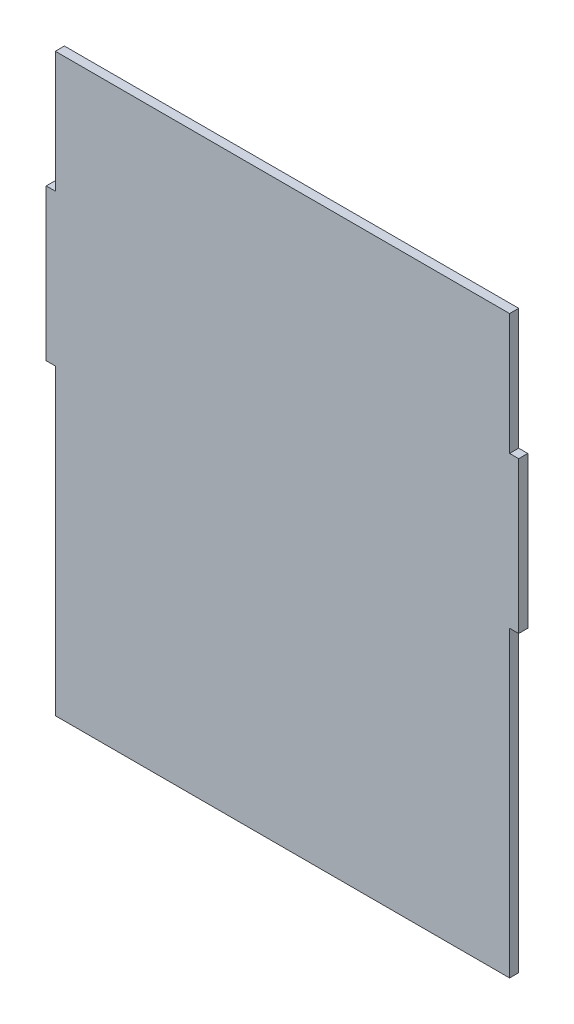
ISO-10303-21;
HEADER;
FILE_DESCRIPTION(('STEP AP214'),'2;1');
FILE_NAME('part.step','',(''),(''),'','','');
FILE_SCHEMA(('AUTOMOTIVE_DESIGN { 1 0 10303 214 1 1 1 1 }'));
ENDSEC;
DATA;
#1=APPLICATION_CONTEXT('core data for automotive mechanical design processes');
#2=APPLICATION_PROTOCOL_DEFINITION('international standard','automotive_design',2000,#1);
#3=PRODUCT_CONTEXT('',#1,'mechanical');
#4=PRODUCT('Part','Part','',(#3));
#5=PRODUCT_RELATED_PRODUCT_CATEGORY('part','',(#4));
#6=PRODUCT_DEFINITION_FORMATION('','',#4);
#7=PRODUCT_DEFINITION_CONTEXT('part definition',#1,'design');
#8=PRODUCT_DEFINITION('design','',#6,#7);
#9=PRODUCT_DEFINITION_SHAPE('','',#8);
#10=(LENGTH_UNIT() NAMED_UNIT(*) SI_UNIT(.MILLI.,.METRE.));
#11=(NAMED_UNIT(*) PLANE_ANGLE_UNIT() SI_UNIT($,.RADIAN.));
#12=(NAMED_UNIT(*) SI_UNIT($,.STERADIAN.) SOLID_ANGLE_UNIT());
#13=UNCERTAINTY_MEASURE_WITH_UNIT(LENGTH_MEASURE(1.E-05),#10,'distance_accuracy_value','');
#14=(GEOMETRIC_REPRESENTATION_CONTEXT(3) GLOBAL_UNCERTAINTY_ASSIGNED_CONTEXT((#13)) GLOBAL_UNIT_ASSIGNED_CONTEXT((#10,
#11,#12)) REPRESENTATION_CONTEXT('',''));
#15=CARTESIAN_POINT('',(0.,0.,0.));
#16=DIRECTION('',(0.,0.,1.));
#17=DIRECTION('',(1.,0.,0.));
#18=AXIS2_PLACEMENT_3D('',#15,#16,#17);
#19=CARTESIAN_POINT('',(0.,0.,3.));
#20=DIRECTION('',(1.,0.,0.));
#21=DIRECTION('',(0.,1.,0.));
#22=AXIS2_PLACEMENT_3D('',#19,#20,#21);
#23=PLANE('',#22);
#24=DIRECTION('',(0.,-1.,0.));
#25=VECTOR('',#24,1.);
#26=CARTESIAN_POINT('',(0.,0.,0.));
#27=LINE('',#26,#25);
#28=CARTESIAN_POINT('',(0.,100.,0.));
#29=VERTEX_POINT('',#28);
#30=CARTESIAN_POINT('',(0.,0.,0.));
#31=VERTEX_POINT('',#30);
#32=EDGE_CURVE('E164',#29,#31,#27,.T.);
#33=ORIENTED_EDGE('',*,*,#32,.T.);
#34=DIRECTION('',(0.,0.,-1.));
#35=VECTOR('',#34,1.);
#36=CARTESIAN_POINT('',(0.,0.,3.));
#37=LINE('',#36,#35);
#38=CARTESIAN_POINT('',(0.,0.,3.));
#39=VERTEX_POINT('',#38);
#40=EDGE_CURVE('E11',#39,#31,#37,.T.);
#41=ORIENTED_EDGE('',*,*,#40,.F.);
#42=DIRECTION('',(0.,-1.,0.));
#43=VECTOR('',#42,1.);
#44=CARTESIAN_POINT('',(0.,0.,3.));
#45=LINE('',#44,#43);
#46=CARTESIAN_POINT('',(0.,100.,3.));
#47=VERTEX_POINT('',#46);
#48=EDGE_CURVE('E198',#47,#39,#45,.T.);
#49=ORIENTED_EDGE('',*,*,#48,.F.);
#50=DIRECTION('',(0.,0.,-1.));
#51=VECTOR('',#50,1.);
#52=CARTESIAN_POINT('',(0.,100.,3.));
#53=LINE('',#52,#51);
#54=EDGE_CURVE('E160',#47,#29,#53,.T.);
#55=ORIENTED_EDGE('',*,*,#54,.T.);
#56=EDGE_LOOP('',(#33,#41,#49,#55));
#57=FACE_BOUND('',#56,.T.);
#58=ADVANCED_FACE('F39',(#57),#23,.F.);
#59=CARTESIAN_POINT('',(0.,0.,3.));
#60=DIRECTION('',(0.,1.,0.));
#61=DIRECTION('',(0.,0.,1.));
#62=AXIS2_PLACEMENT_3D('',#59,#60,#61);
#63=PLANE('',#62);
#64=DIRECTION('',(1.,0.,0.));
#65=VECTOR('',#64,1.);
#66=CARTESIAN_POINT('',(0.,0.,0.));
#67=LINE('',#66,#65);
#68=CARTESIAN_POINT('',(150.,0.,0.));
#69=VERTEX_POINT('',#68);
#70=EDGE_CURVE('E168',#31,#69,#67,.T.);
#71=ORIENTED_EDGE('',*,*,#70,.T.);
#72=DIRECTION('',(0.,0.,-1.));
#73=VECTOR('',#72,1.);
#74=CARTESIAN_POINT('',(150.,0.,3.));
#75=LINE('',#74,#73);
#76=CARTESIAN_POINT('',(150.,0.,3.));
#77=VERTEX_POINT('',#76);
#78=EDGE_CURVE('E48',#77,#69,#75,.T.);
#79=ORIENTED_EDGE('',*,*,#78,.F.);
#80=DIRECTION('',(1.,0.,0.));
#81=VECTOR('',#80,1.);
#82=CARTESIAN_POINT('',(0.,0.,3.));
#83=LINE('',#82,#81);
#84=EDGE_CURVE('E111',#39,#77,#83,.T.);
#85=ORIENTED_EDGE('',*,*,#84,.F.);
#86=ORIENTED_EDGE('',*,*,#40,.T.);
#87=EDGE_LOOP('',(#71,#79,#85,#86));
#88=FACE_BOUND('',#87,.T.);
#89=ADVANCED_FACE('F292',(#88),#63,.F.);
#90=CARTESIAN_POINT('',(150.,0.,3.));
#91=DIRECTION('',(-1.,0.,0.));
#92=DIRECTION('',(0.,0.,1.));
#93=AXIS2_PLACEMENT_3D('',#90,#91,#92);
#94=PLANE('',#93);
#95=DIRECTION('',(0.,1.,0.));
#96=VECTOR('',#95,1.);
#97=CARTESIAN_POINT('',(150.,0.,0.));
#98=LINE('',#97,#96);
#99=CARTESIAN_POINT('',(150.,100.,0.));
#100=VERTEX_POINT('',#99);
#101=EDGE_CURVE('E171',#69,#100,#98,.T.);
#102=ORIENTED_EDGE('',*,*,#101,.T.);
#103=DIRECTION('',(0.,0.,-1.));
#104=VECTOR('',#103,1.);
#105=CARTESIAN_POINT('',(150.,100.,3.));
#106=LINE('',#105,#104);
#107=CARTESIAN_POINT('',(150.,100.,3.));
#108=VERTEX_POINT('',#107);
#109=EDGE_CURVE('E225',#108,#100,#106,.T.);
#110=ORIENTED_EDGE('',*,*,#109,.F.);
#111=DIRECTION('',(0.,1.,0.));
#112=VECTOR('',#111,1.);
#113=CARTESIAN_POINT('',(150.,0.,3.));
#114=LINE('',#113,#112);
#115=EDGE_CURVE('E235',#77,#108,#114,.T.);
#116=ORIENTED_EDGE('',*,*,#115,.F.);
#117=ORIENTED_EDGE('',*,*,#78,.T.);
#118=EDGE_LOOP('',(#102,#110,#116,#117));
#119=FACE_BOUND('',#118,.T.);
#120=ADVANCED_FACE('F233',(#119),#94,.F.);
#121=CARTESIAN_POINT('',(150.,100.,3.));
#122=DIRECTION('',(0.,1.,0.));
#123=DIRECTION('',(0.,0.,1.));
#124=AXIS2_PLACEMENT_3D('',#121,#122,#123);
#125=PLANE('',#124);
#126=DIRECTION('',(1.,0.,0.));
#127=VECTOR('',#126,1.);
#128=CARTESIAN_POINT('',(150.,100.,0.));
#129=LINE('',#128,#127);
#130=CARTESIAN_POINT('',(153.,100.,0.));
#131=VERTEX_POINT('',#130);
#132=EDGE_CURVE('E174',#100,#131,#129,.T.);
#133=ORIENTED_EDGE('',*,*,#132,.T.);
#134=DIRECTION('',(0.,0.,-1.));
#135=VECTOR('',#134,1.);
#136=CARTESIAN_POINT('',(153.,100.,3.));
#137=LINE('',#136,#135);
#138=CARTESIAN_POINT('',(153.,100.,3.));
#139=VERTEX_POINT('',#138);
#140=EDGE_CURVE('E221',#139,#131,#137,.T.);
#141=ORIENTED_EDGE('',*,*,#140,.F.);
#142=DIRECTION('',(1.,0.,0.));
#143=VECTOR('',#142,1.);
#144=CARTESIAN_POINT('',(150.,100.,3.));
#145=LINE('',#144,#143);
#146=EDGE_CURVE('E254',#108,#139,#145,.T.);
#147=ORIENTED_EDGE('',*,*,#146,.F.);
#148=ORIENTED_EDGE('',*,*,#109,.T.);
#149=EDGE_LOOP('',(#133,#141,#147,#148));
#150=FACE_BOUND('',#149,.T.);
#151=ADVANCED_FACE('F244',(#150),#125,.F.);
#152=CARTESIAN_POINT('',(153.,150.,3.));
#153=DIRECTION('',(-1.,0.,0.));
#154=DIRECTION('',(0.,0.,1.));
#155=AXIS2_PLACEMENT_3D('',#152,#153,#154);
#156=PLANE('',#155);
#157=DIRECTION('',(0.,1.,0.));
#158=VECTOR('',#157,1.);
#159=CARTESIAN_POINT('',(153.,150.,0.));
#160=LINE('',#159,#158);
#161=CARTESIAN_POINT('',(153.,150.,0.));
#162=VERTEX_POINT('',#161);
#163=EDGE_CURVE('E177',#131,#162,#160,.T.);
#164=ORIENTED_EDGE('',*,*,#163,.T.);
#165=DIRECTION('',(0.,0.,-1.));
#166=VECTOR('',#165,1.);
#167=CARTESIAN_POINT('',(153.,150.,3.));
#168=LINE('',#167,#166);
#169=CARTESIAN_POINT('',(153.,150.,3.));
#170=VERTEX_POINT('',#169);
#171=EDGE_CURVE('E217',#170,#162,#168,.T.);
#172=ORIENTED_EDGE('',*,*,#171,.F.);
#173=DIRECTION('',(0.,1.,0.));
#174=VECTOR('',#173,1.);
#175=CARTESIAN_POINT('',(153.,150.,3.));
#176=LINE('',#175,#174);
#177=EDGE_CURVE('E250',#139,#170,#176,.T.);
#178=ORIENTED_EDGE('',*,*,#177,.F.);
#179=ORIENTED_EDGE('',*,*,#140,.T.);
#180=EDGE_LOOP('',(#164,#172,#178,#179));
#181=FACE_BOUND('',#180,.T.);
#182=ADVANCED_FACE('F248',(#181),#156,.F.);
#183=CARTESIAN_POINT('',(150.,150.,3.));
#184=DIRECTION('',(0.,-1.,0.));
#185=DIRECTION('',(0.,0.,-1.));
#186=AXIS2_PLACEMENT_3D('',#183,#184,#185);
#187=PLANE('',#186);
#188=DIRECTION('',(-1.,0.,0.));
#189=VECTOR('',#188,1.);
#190=CARTESIAN_POINT('',(150.,150.,0.));
#191=LINE('',#190,#189);
#192=CARTESIAN_POINT('',(150.,150.,0.));
#193=VERTEX_POINT('',#192);
#194=EDGE_CURVE('E180',#162,#193,#191,.T.);
#195=ORIENTED_EDGE('',*,*,#194,.T.);
#196=DIRECTION('',(0.,0.,-1.));
#197=VECTOR('',#196,1.);
#198=CARTESIAN_POINT('',(150.,150.,3.));
#199=LINE('',#198,#197);
#200=CARTESIAN_POINT('',(150.,150.,3.));
#201=VERTEX_POINT('',#200);
#202=EDGE_CURVE('E213',#201,#193,#199,.T.);
#203=ORIENTED_EDGE('',*,*,#202,.F.);
#204=DIRECTION('',(-1.,0.,0.));
#205=VECTOR('',#204,1.);
#206=CARTESIAN_POINT('',(150.,150.,3.));
#207=LINE('',#206,#205);
#208=EDGE_CURVE('E253',#170,#201,#207,.T.);
#209=ORIENTED_EDGE('',*,*,#208,.F.);
#210=ORIENTED_EDGE('',*,*,#171,.T.);
#211=EDGE_LOOP('',(#195,#203,#209,#210));
#212=FACE_BOUND('',#211,.T.);
#213=ADVANCED_FACE('F305',(#212),#187,.F.);
#214=CARTESIAN_POINT('',(150.,150.,3.));
#215=DIRECTION('',(-1.,0.,0.));
#216=DIRECTION('',(0.,0.,1.));
#217=AXIS2_PLACEMENT_3D('',#214,#215,#216);
#218=PLANE('',#217);
#219=DIRECTION('',(0.,1.,0.));
#220=VECTOR('',#219,1.);
#221=CARTESIAN_POINT('',(150.,150.,0.));
#222=LINE('',#221,#220);
#223=CARTESIAN_POINT('',(150.,190.,0.));
#224=VERTEX_POINT('',#223);
#225=EDGE_CURVE('E183',#193,#224,#222,.T.);
#226=ORIENTED_EDGE('',*,*,#225,.T.);
#227=DIRECTION('',(0.,0.,-1.));
#228=VECTOR('',#227,1.);
#229=CARTESIAN_POINT('',(150.,190.,3.));
#230=LINE('',#229,#228);
#231=CARTESIAN_POINT('',(150.,190.,3.));
#232=VERTEX_POINT('',#231);
#233=EDGE_CURVE('E209',#232,#224,#230,.T.);
#234=ORIENTED_EDGE('',*,*,#233,.F.);
#235=DIRECTION('',(0.,1.,0.));
#236=VECTOR('',#235,1.);
#237=CARTESIAN_POINT('',(150.,150.,3.));
#238=LINE('',#237,#236);
#239=EDGE_CURVE('E258',#201,#232,#238,.T.);
#240=ORIENTED_EDGE('',*,*,#239,.F.);
#241=ORIENTED_EDGE('',*,*,#202,.T.);
#242=EDGE_LOOP('',(#226,#234,#240,#241));
#243=FACE_BOUND('',#242,.T.);
#244=ADVANCED_FACE('F308',(#243),#218,.F.);
#245=CARTESIAN_POINT('',(0.,190.,3.));
#246=DIRECTION('',(0.,-1.,0.));
#247=DIRECTION('',(0.,0.,-1.));
#248=AXIS2_PLACEMENT_3D('',#245,#246,#247);
#249=PLANE('',#248);
#250=DIRECTION('',(-1.,0.,0.));
#251=VECTOR('',#250,1.);
#252=CARTESIAN_POINT('',(0.,190.,0.));
#253=LINE('',#252,#251);
#254=CARTESIAN_POINT('',(0.,190.,0.));
#255=VERTEX_POINT('',#254);
#256=EDGE_CURVE('E186',#224,#255,#253,.T.);
#257=ORIENTED_EDGE('',*,*,#256,.T.);
#258=DIRECTION('',(0.,0.,-1.));
#259=VECTOR('',#258,1.);
#260=CARTESIAN_POINT('',(0.,190.,3.));
#261=LINE('',#260,#259);
#262=CARTESIAN_POINT('',(0.,190.,3.));
#263=VERTEX_POINT('',#262);
#264=EDGE_CURVE('E205',#263,#255,#261,.T.);
#265=ORIENTED_EDGE('',*,*,#264,.F.);
#266=DIRECTION('',(-1.,0.,0.));
#267=VECTOR('',#266,1.);
#268=CARTESIAN_POINT('',(0.,190.,3.));
#269=LINE('',#268,#267);
#270=EDGE_CURVE('E265',#232,#263,#269,.T.);
#271=ORIENTED_EDGE('',*,*,#270,.F.);
#272=ORIENTED_EDGE('',*,*,#233,.T.);
#273=EDGE_LOOP('',(#257,#265,#271,#272));
#274=FACE_BOUND('',#273,.T.);
#275=ADVANCED_FACE('F273',(#274),#249,.F.);
#276=CARTESIAN_POINT('',(0.,150.,3.));
#277=DIRECTION('',(1.,0.,0.));
#278=DIRECTION('',(0.,1.,0.));
#279=AXIS2_PLACEMENT_3D('',#276,#277,#278);
#280=PLANE('',#279);
#281=DIRECTION('',(0.,-1.,0.));
#282=VECTOR('',#281,1.);
#283=CARTESIAN_POINT('',(0.,150.,0.));
#284=LINE('',#283,#282);
#285=CARTESIAN_POINT('',(0.,150.,0.));
#286=VERTEX_POINT('',#285);
#287=EDGE_CURVE('E189',#255,#286,#284,.T.);
#288=ORIENTED_EDGE('',*,*,#287,.T.);
#289=DIRECTION('',(0.,0.,-1.));
#290=VECTOR('',#289,1.);
#291=CARTESIAN_POINT('',(0.,150.,3.));
#292=LINE('',#291,#290);
#293=CARTESIAN_POINT('',(0.,150.,3.));
#294=VERTEX_POINT('',#293);
#295=EDGE_CURVE('E153',#294,#286,#292,.T.);
#296=ORIENTED_EDGE('',*,*,#295,.F.);
#297=DIRECTION('',(0.,-1.,0.));
#298=VECTOR('',#297,1.);
#299=CARTESIAN_POINT('',(0.,150.,3.));
#300=LINE('',#299,#298);
#301=EDGE_CURVE('E142',#263,#294,#300,.T.);
#302=ORIENTED_EDGE('',*,*,#301,.F.);
#303=ORIENTED_EDGE('',*,*,#264,.T.);
#304=EDGE_LOOP('',(#288,#296,#302,#303));
#305=FACE_BOUND('',#304,.T.);
#306=ADVANCED_FACE('F277',(#305),#280,.F.);
#307=CARTESIAN_POINT('',(-3.00000000000001,150.,3.));
#308=DIRECTION('',(0.,-1.,0.));
#309=DIRECTION('',(0.,0.,-1.));
#310=AXIS2_PLACEMENT_3D('',#307,#308,#309);
#311=PLANE('',#310);
#312=DIRECTION('',(-1.,0.,0.));
#313=VECTOR('',#312,1.);
#314=CARTESIAN_POINT('',(-3.00000000000001,150.,0.));
#315=LINE('',#314,#313);
#316=CARTESIAN_POINT('',(-3.00000000000001,150.,0.));
#317=VERTEX_POINT('',#316);
#318=EDGE_CURVE('E151',#286,#317,#315,.T.);
#319=ORIENTED_EDGE('',*,*,#318,.T.);
#320=DIRECTION('',(0.,0.,-1.));
#321=VECTOR('',#320,1.);
#322=CARTESIAN_POINT('',(-3.00000000000001,150.,3.));
#323=LINE('',#322,#321);
#324=CARTESIAN_POINT('',(-3.00000000000001,150.,3.));
#325=VERTEX_POINT('',#324);
#326=EDGE_CURVE('E148',#325,#317,#323,.T.);
#327=ORIENTED_EDGE('',*,*,#326,.F.);
#328=DIRECTION('',(-1.,0.,0.));
#329=VECTOR('',#328,1.);
#330=CARTESIAN_POINT('',(-3.00000000000001,150.,3.));
#331=LINE('',#330,#329);
#332=EDGE_CURVE('E136',#294,#325,#331,.T.);
#333=ORIENTED_EDGE('',*,*,#332,.F.);
#334=ORIENTED_EDGE('',*,*,#295,.T.);
#335=EDGE_LOOP('',(#319,#327,#333,#334));
#336=FACE_BOUND('',#335,.T.);
#337=ADVANCED_FACE('F149',(#336),#311,.F.);
#338=CARTESIAN_POINT('',(-3.00000000000001,150.,3.));
#339=DIRECTION('',(1.,0.,0.));
#340=DIRECTION('',(0.,1.,0.));
#341=AXIS2_PLACEMENT_3D('',#338,#339,#340);
#342=PLANE('',#341);
#343=DIRECTION('',(0.,-1.,0.));
#344=VECTOR('',#343,1.);
#345=CARTESIAN_POINT('',(-3.00000000000001,150.,0.));
#346=LINE('',#345,#344);
#347=CARTESIAN_POINT('',(-3.00000000000001,100.,0.));
#348=VERTEX_POINT('',#347);
#349=EDGE_CURVE('E97',#317,#348,#346,.T.);
#350=ORIENTED_EDGE('',*,*,#349,.T.);
#351=DIRECTION('',(0.,0.,-1.));
#352=VECTOR('',#351,1.);
#353=CARTESIAN_POINT('',(-3.00000000000001,100.,3.));
#354=LINE('',#353,#352);
#355=CARTESIAN_POINT('',(-3.00000000000001,100.,3.));
#356=VERTEX_POINT('',#355);
#357=EDGE_CURVE('E154',#356,#348,#354,.T.);
#358=ORIENTED_EDGE('',*,*,#357,.F.);
#359=DIRECTION('',(0.,-1.,0.));
#360=VECTOR('',#359,1.);
#361=CARTESIAN_POINT('',(-3.00000000000001,150.,3.));
#362=LINE('',#361,#360);
#363=EDGE_CURVE('E140',#325,#356,#362,.T.);
#364=ORIENTED_EDGE('',*,*,#363,.F.);
#365=ORIENTED_EDGE('',*,*,#326,.T.);
#366=EDGE_LOOP('',(#350,#358,#364,#365));
#367=FACE_BOUND('',#366,.T.);
#368=ADVANCED_FACE('F156',(#367),#342,.F.);
#369=CARTESIAN_POINT('',(-3.00000000000001,100.,3.));
#370=DIRECTION('',(0.,1.,0.));
#371=DIRECTION('',(0.,0.,1.));
#372=AXIS2_PLACEMENT_3D('',#369,#370,#371);
#373=PLANE('',#372);
#374=DIRECTION('',(1.,0.,0.));
#375=VECTOR('',#374,1.);
#376=CARTESIAN_POINT('',(-3.00000000000001,100.,0.));
#377=LINE('',#376,#375);
#378=EDGE_CURVE('E103',#348,#29,#377,.T.);
#379=ORIENTED_EDGE('',*,*,#378,.T.);
#380=ORIENTED_EDGE('',*,*,#54,.F.);
#381=DIRECTION('',(1.,0.,0.));
#382=VECTOR('',#381,1.);
#383=CARTESIAN_POINT('',(-3.00000000000001,100.,3.));
#384=LINE('',#383,#382);
#385=EDGE_CURVE('E56',#356,#47,#384,.T.);
#386=ORIENTED_EDGE('',*,*,#385,.F.);
#387=ORIENTED_EDGE('',*,*,#357,.T.);
#388=EDGE_LOOP('',(#379,#380,#386,#387));
#389=FACE_BOUND('',#388,.T.);
#390=ADVANCED_FACE('F281',(#389),#373,.F.);
#391=CARTESIAN_POINT('',(0.,0.,3.));
#392=DIRECTION('',(0.,0.,-1.));
#393=DIRECTION('',(-1.,0.,0.));
#394=AXIS2_PLACEMENT_3D('',#391,#392,#393);
#395=PLANE('',#394);
#396=ORIENTED_EDGE('',*,*,#48,.T.);
#397=ORIENTED_EDGE('',*,*,#84,.T.);
#398=ORIENTED_EDGE('',*,*,#115,.T.);
#399=ORIENTED_EDGE('',*,*,#146,.T.);
#400=ORIENTED_EDGE('',*,*,#177,.T.);
#401=ORIENTED_EDGE('',*,*,#208,.T.);
#402=ORIENTED_EDGE('',*,*,#239,.T.);
#403=ORIENTED_EDGE('',*,*,#270,.T.);
#404=ORIENTED_EDGE('',*,*,#301,.T.);
#405=ORIENTED_EDGE('',*,*,#332,.T.);
#406=ORIENTED_EDGE('',*,*,#363,.T.);
#407=ORIENTED_EDGE('',*,*,#385,.T.);
#408=EDGE_LOOP('',(#396,#397,#398,#399,#400,#401,#402,#403,#404,#405,#406,#407));
#409=FACE_BOUND('',#408,.T.);
#410=ADVANCED_FACE('F138',(#409),#395,.F.);
#411=CARTESIAN_POINT('',(0.,0.,0.));
#412=DIRECTION('',(0.,0.,-1.));
#413=DIRECTION('',(-1.,0.,0.));
#414=AXIS2_PLACEMENT_3D('',#411,#412,#413);
#415=PLANE('',#414);
#416=ORIENTED_EDGE('',*,*,#32,.F.);
#417=ORIENTED_EDGE('',*,*,#378,.F.);
#418=ORIENTED_EDGE('',*,*,#349,.F.);
#419=ORIENTED_EDGE('',*,*,#318,.F.);
#420=ORIENTED_EDGE('',*,*,#287,.F.);
#421=ORIENTED_EDGE('',*,*,#256,.F.);
#422=ORIENTED_EDGE('',*,*,#225,.F.);
#423=ORIENTED_EDGE('',*,*,#194,.F.);
#424=ORIENTED_EDGE('',*,*,#163,.F.);
#425=ORIENTED_EDGE('',*,*,#132,.F.);
#426=ORIENTED_EDGE('',*,*,#101,.F.);
#427=ORIENTED_EDGE('',*,*,#70,.F.);
#428=EDGE_LOOP('',(#416,#417,#418,#419,#420,#421,#422,#423,#424,#425,#426,#427));
#429=FACE_BOUND('',#428,.T.);
#430=ADVANCED_FACE('F239',(#429),#415,.T.);
#431=CLOSED_SHELL('',(#58,#89,#120,#151,#182,#213,#244,#275,#306,#337,#368,#390,#410,#430));
#432=MANIFOLD_SOLID_BREP('B2',#431);
#433=ADVANCED_BREP_SHAPE_REPRESENTATION('',(#18,#432),#14);
#434=SHAPE_DEFINITION_REPRESENTATION(#9,#433);
ENDSEC;
END-ISO-10303-21;
